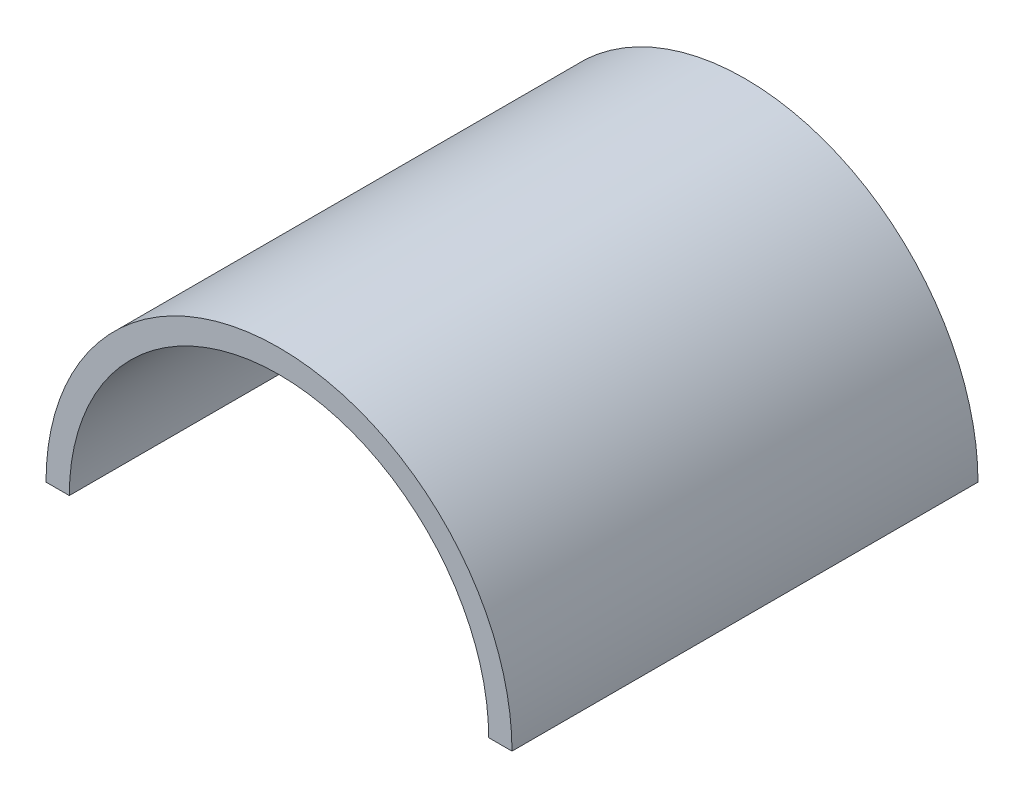
ISO-10303-21;
HEADER;
FILE_DESCRIPTION(('STEP AP214'),'2;1');
FILE_NAME('part.step','',(''),(''),'','','');
FILE_SCHEMA(('AUTOMOTIVE_DESIGN { 1 0 10303 214 1 1 1 1 }'));
ENDSEC;
DATA;
#1=APPLICATION_CONTEXT('core data for automotive mechanical design processes');
#2=APPLICATION_PROTOCOL_DEFINITION('international standard','automotive_design',2000,#1);
#3=PRODUCT_CONTEXT('',#1,'mechanical');
#4=PRODUCT('Part','Part','',(#3));
#5=PRODUCT_RELATED_PRODUCT_CATEGORY('part','',(#4));
#6=PRODUCT_DEFINITION_FORMATION('','',#4);
#7=PRODUCT_DEFINITION_CONTEXT('part definition',#1,'design');
#8=PRODUCT_DEFINITION('design','',#6,#7);
#9=PRODUCT_DEFINITION_SHAPE('','',#8);
#10=(LENGTH_UNIT() NAMED_UNIT(*) SI_UNIT(.MILLI.,.METRE.));
#11=(NAMED_UNIT(*) PLANE_ANGLE_UNIT() SI_UNIT($,.RADIAN.));
#12=(NAMED_UNIT(*) SI_UNIT($,.STERADIAN.) SOLID_ANGLE_UNIT());
#13=UNCERTAINTY_MEASURE_WITH_UNIT(LENGTH_MEASURE(1.E-05),#10,'distance_accuracy_value','');
#14=(GEOMETRIC_REPRESENTATION_CONTEXT(3) GLOBAL_UNCERTAINTY_ASSIGNED_CONTEXT((#13)) GLOBAL_UNIT_ASSIGNED_CONTEXT((#10,
#11,#12)) REPRESENTATION_CONTEXT('',''));
#15=CARTESIAN_POINT('',(0.,0.,0.));
#16=DIRECTION('',(0.,0.,1.));
#17=DIRECTION('',(1.,0.,0.));
#18=AXIS2_PLACEMENT_3D('',#15,#16,#17);
#19=CARTESIAN_POINT('',(0.,0.,50.));
#20=DIRECTION('',(0.,1.,0.));
#21=DIRECTION('',(0.,0.,1.));
#22=AXIS2_PLACEMENT_3D('',#19,#20,#21);
#23=PLANE('',#22);
#24=DIRECTION('',(1.,0.,0.));
#25=VECTOR('',#24,1.);
#26=CARTESIAN_POINT('',(0.,0.,0.));
#27=LINE('',#26,#25);
#28=CARTESIAN_POINT('',(22.5,0.,0.));
#29=VERTEX_POINT('',#28);
#30=CARTESIAN_POINT('',(25.,0.,0.));
#31=VERTEX_POINT('',#30);
#32=EDGE_CURVE('E98',#29,#31,#27,.T.);
#33=ORIENTED_EDGE('',*,*,#32,.T.);
#34=DIRECTION('',(0.,0.,-1.));
#35=VECTOR('',#34,1.);
#36=CARTESIAN_POINT('',(25.,0.,50.));
#37=LINE('',#36,#35);
#38=CARTESIAN_POINT('',(25.,0.,50.));
#39=VERTEX_POINT('',#38);
#40=EDGE_CURVE('E11',#39,#31,#37,.T.);
#41=ORIENTED_EDGE('',*,*,#40,.F.);
#42=DIRECTION('',(1.,0.,0.));
#43=VECTOR('',#42,1.);
#44=CARTESIAN_POINT('',(0.,0.,50.));
#45=LINE('',#44,#43);
#46=CARTESIAN_POINT('',(22.5,0.,50.));
#47=VERTEX_POINT('',#46);
#48=EDGE_CURVE('E84',#47,#39,#45,.T.);
#49=ORIENTED_EDGE('',*,*,#48,.F.);
#50=DIRECTION('',(0.,0.,-1.));
#51=VECTOR('',#50,1.);
#52=CARTESIAN_POINT('',(22.5,0.,50.));
#53=LINE('',#52,#51);
#54=EDGE_CURVE('E51',#47,#29,#53,.T.);
#55=ORIENTED_EDGE('',*,*,#54,.T.);
#56=EDGE_LOOP('',(#33,#41,#49,#55));
#57=FACE_BOUND('',#56,.T.);
#58=ADVANCED_FACE('F35',(#57),#23,.F.);
#59=CARTESIAN_POINT('',(0.,0.,50.));
#60=DIRECTION('',(0.,0.,-1.));
#61=DIRECTION('',(-1.,0.,0.));
#62=AXIS2_PLACEMENT_3D('',#59,#60,#61);
#63=CYLINDRICAL_SURFACE('',#62,25.);
#64=CARTESIAN_POINT('',(0.,0.,0.));
#65=DIRECTION('',(0.,0.,1.));
#66=DIRECTION('',(1.,0.,0.));
#67=AXIS2_PLACEMENT_3D('',#64,#65,#66);
#68=CIRCLE('',#67,25.);
#69=CARTESIAN_POINT('',(-25.,0.,0.));
#70=VERTEX_POINT('',#69);
#71=EDGE_CURVE('E89',#31,#70,#68,.T.);
#72=ORIENTED_EDGE('',*,*,#71,.T.);
#73=DIRECTION('',(0.,0.,-1.));
#74=VECTOR('',#73,1.);
#75=CARTESIAN_POINT('',(-25.,0.,50.));
#76=LINE('',#75,#74);
#77=CARTESIAN_POINT('',(-25.,0.,50.));
#78=VERTEX_POINT('',#77);
#79=EDGE_CURVE('E43',#78,#70,#76,.T.);
#80=ORIENTED_EDGE('',*,*,#79,.F.);
#81=CARTESIAN_POINT('',(0.,0.,50.));
#82=DIRECTION('',(0.,0.,1.));
#83=DIRECTION('',(1.,0.,0.));
#84=AXIS2_PLACEMENT_3D('',#81,#82,#83);
#85=CIRCLE('',#84,25.);
#86=EDGE_CURVE('E76',#39,#78,#85,.T.);
#87=ORIENTED_EDGE('',*,*,#86,.F.);
#88=ORIENTED_EDGE('',*,*,#40,.T.);
#89=EDGE_LOOP('',(#72,#80,#87,#88));
#90=FACE_BOUND('',#89,.T.);
#91=ADVANCED_FACE('F88',(#90),#63,.T.);
#92=CARTESIAN_POINT('',(0.,0.,50.));
#93=DIRECTION('',(0.,-1.,0.));
#94=DIRECTION('',(0.,0.,-1.));
#95=AXIS2_PLACEMENT_3D('',#92,#93,#94);
#96=PLANE('',#95);
#97=DIRECTION('',(-1.,0.,0.));
#98=VECTOR('',#97,1.);
#99=CARTESIAN_POINT('',(0.,0.,0.));
#100=LINE('',#99,#98);
#101=CARTESIAN_POINT('',(-22.5,0.,0.));
#102=VERTEX_POINT('',#101);
#103=EDGE_CURVE('E101',#102,#70,#100,.T.);
#104=ORIENTED_EDGE('',*,*,#103,.F.);
#105=DIRECTION('',(0.,0.,-1.));
#106=VECTOR('',#105,1.);
#107=CARTESIAN_POINT('',(-22.5,0.,50.));
#108=LINE('',#107,#106);
#109=CARTESIAN_POINT('',(-22.5,0.,50.));
#110=VERTEX_POINT('',#109);
#111=EDGE_CURVE('E65',#110,#102,#108,.T.);
#112=ORIENTED_EDGE('',*,*,#111,.F.);
#113=DIRECTION('',(-1.,0.,0.));
#114=VECTOR('',#113,1.);
#115=CARTESIAN_POINT('',(0.,0.,50.));
#116=LINE('',#115,#114);
#117=EDGE_CURVE('E83',#110,#78,#116,.T.);
#118=ORIENTED_EDGE('',*,*,#117,.T.);
#119=ORIENTED_EDGE('',*,*,#79,.T.);
#120=EDGE_LOOP('',(#104,#112,#118,#119));
#121=FACE_BOUND('',#120,.T.);
#122=ADVANCED_FACE('F92',(#121),#96,.T.);
#123=CARTESIAN_POINT('',(0.,0.,50.));
#124=DIRECTION('',(0.,0.,-1.));
#125=DIRECTION('',(-1.,0.,0.));
#126=AXIS2_PLACEMENT_3D('',#123,#124,#125);
#127=CYLINDRICAL_SURFACE('',#126,22.5);
#128=CARTESIAN_POINT('',(0.,0.,0.));
#129=DIRECTION('',(0.,0.,1.));
#130=DIRECTION('',(1.,0.,0.));
#131=AXIS2_PLACEMENT_3D('',#128,#129,#130);
#132=CIRCLE('',#131,22.5);
#133=EDGE_CURVE('E103',#29,#102,#132,.T.);
#134=ORIENTED_EDGE('',*,*,#133,.F.);
#135=ORIENTED_EDGE('',*,*,#54,.F.);
#136=CARTESIAN_POINT('',(0.,0.,50.));
#137=DIRECTION('',(0.,0.,1.));
#138=DIRECTION('',(1.,0.,0.));
#139=AXIS2_PLACEMENT_3D('',#136,#137,#138);
#140=CIRCLE('',#139,22.5);
#141=EDGE_CURVE('E93',#47,#110,#140,.T.);
#142=ORIENTED_EDGE('',*,*,#141,.T.);
#143=ORIENTED_EDGE('',*,*,#111,.T.);
#144=EDGE_LOOP('',(#134,#135,#142,#143));
#145=FACE_BOUND('',#144,.T.);
#146=ADVANCED_FACE('F109',(#145),#127,.F.);
#147=CARTESIAN_POINT('',(0.,0.,50.));
#148=DIRECTION('',(0.,0.,1.));
#149=DIRECTION('',(1.,0.,0.));
#150=AXIS2_PLACEMENT_3D('',#147,#148,#149);
#151=PLANE('',#150);
#152=ORIENTED_EDGE('',*,*,#48,.T.);
#153=ORIENTED_EDGE('',*,*,#86,.T.);
#154=ORIENTED_EDGE('',*,*,#117,.F.);
#155=ORIENTED_EDGE('',*,*,#141,.F.);
#156=EDGE_LOOP('',(#152,#153,#154,#155));
#157=FACE_BOUND('',#156,.T.);
#158=ADVANCED_FACE('F80',(#157),#151,.T.);
#159=CARTESIAN_POINT('',(0.,0.,0.));
#160=DIRECTION('',(0.,0.,1.));
#161=DIRECTION('',(1.,0.,0.));
#162=AXIS2_PLACEMENT_3D('',#159,#160,#161);
#163=PLANE('',#162);
#164=ORIENTED_EDGE('',*,*,#32,.F.);
#165=ORIENTED_EDGE('',*,*,#133,.T.);
#166=ORIENTED_EDGE('',*,*,#103,.T.);
#167=ORIENTED_EDGE('',*,*,#71,.F.);
#168=EDGE_LOOP('',(#164,#165,#166,#167));
#169=FACE_BOUND('',#168,.T.);
#170=ADVANCED_FACE('F108',(#169),#163,.F.);
#171=CLOSED_SHELL('',(#58,#91,#122,#146,#158,#170));
#172=MANIFOLD_SOLID_BREP('B2',#171);
#173=ADVANCED_BREP_SHAPE_REPRESENTATION('',(#18,#172),#14);
#174=SHAPE_DEFINITION_REPRESENTATION(#9,#173);
ENDSEC;
END-ISO-10303-21;
